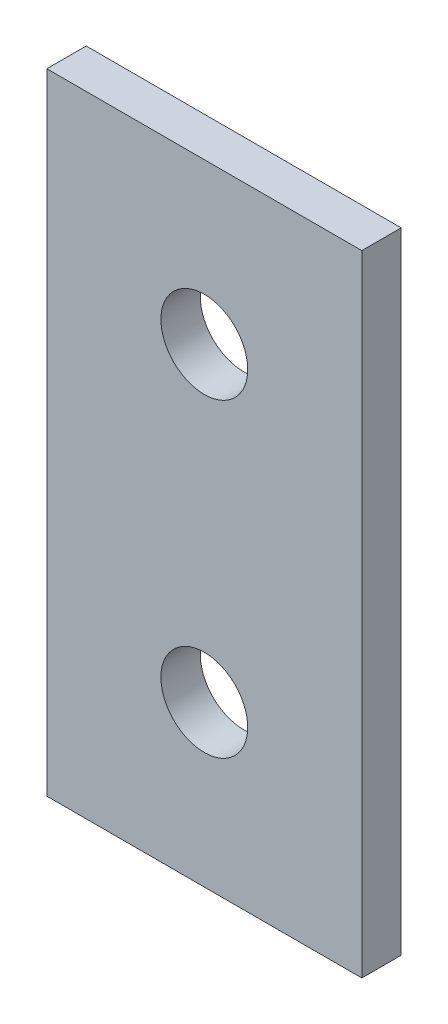
ISO-10303-21;
HEADER;
FILE_DESCRIPTION(('STEP AP214'),'2;1');
FILE_NAME('part.step','',(''),(''),'','','');
FILE_SCHEMA(('AUTOMOTIVE_DESIGN { 1 0 10303 214 1 1 1 1 }'));
ENDSEC;
DATA;
#1=APPLICATION_CONTEXT('core data for automotive mechanical design processes');
#2=APPLICATION_PROTOCOL_DEFINITION('international standard','automotive_design',2000,#1);
#3=PRODUCT_CONTEXT('',#1,'mechanical');
#4=PRODUCT('Part','Part','',(#3));
#5=PRODUCT_RELATED_PRODUCT_CATEGORY('part','',(#4));
#6=PRODUCT_DEFINITION_FORMATION('','',#4);
#7=PRODUCT_DEFINITION_CONTEXT('part definition',#1,'design');
#8=PRODUCT_DEFINITION('design','',#6,#7);
#9=PRODUCT_DEFINITION_SHAPE('','',#8);
#10=(LENGTH_UNIT() NAMED_UNIT(*) SI_UNIT(.MILLI.,.METRE.));
#11=(NAMED_UNIT(*) PLANE_ANGLE_UNIT() SI_UNIT($,.RADIAN.));
#12=(NAMED_UNIT(*) SI_UNIT($,.STERADIAN.) SOLID_ANGLE_UNIT());
#13=UNCERTAINTY_MEASURE_WITH_UNIT(LENGTH_MEASURE(1.E-05),#10,'distance_accuracy_value','');
#14=(GEOMETRIC_REPRESENTATION_CONTEXT(3) GLOBAL_UNCERTAINTY_ASSIGNED_CONTEXT((#13)) GLOBAL_UNIT_ASSIGNED_CONTEXT((#10,
#11,#12)) REPRESENTATION_CONTEXT('',''));
#15=CARTESIAN_POINT('',(0.,0.,0.));
#16=DIRECTION('',(0.,0.,1.));
#17=DIRECTION('',(1.,0.,0.));
#18=AXIS2_PLACEMENT_3D('',#15,#16,#17);
#19=CARTESIAN_POINT('',(0.,0.,3.175));
#20=DIRECTION('',(0.,0.,-1.));
#21=DIRECTION('',(-1.,0.,0.));
#22=AXIS2_PLACEMENT_3D('',#19,#20,#21);
#23=PLANE('',#22);
#24=DIRECTION('',(0.,1.,0.));
#25=VECTOR('',#24,1.);
#26=CARTESIAN_POINT('',(12.7,-25.4,3.175));
#27=LINE('',#26,#25);
#28=CARTESIAN_POINT('',(12.7,-25.4,3.175));
#29=VERTEX_POINT('',#28);
#30=CARTESIAN_POINT('',(12.7,25.4,3.175));
#31=VERTEX_POINT('',#30);
#32=EDGE_CURVE('E91',#29,#31,#27,.T.);
#33=ORIENTED_EDGE('',*,*,#32,.T.);
#34=DIRECTION('',(-1.,0.,0.));
#35=VECTOR('',#34,1.);
#36=CARTESIAN_POINT('',(-12.7,25.4,3.175));
#37=LINE('',#36,#35);
#38=CARTESIAN_POINT('',(-12.7,25.4,3.175));
#39=VERTEX_POINT('',#38);
#40=EDGE_CURVE('E86',#31,#39,#37,.T.);
#41=ORIENTED_EDGE('',*,*,#40,.T.);
#42=DIRECTION('',(0.,-1.,0.));
#43=VECTOR('',#42,1.);
#44=CARTESIAN_POINT('',(-12.7,-25.4,3.175));
#45=LINE('',#44,#43);
#46=CARTESIAN_POINT('',(-12.7,-25.4,3.175));
#47=VERTEX_POINT('',#46);
#48=EDGE_CURVE('E89',#39,#47,#45,.T.);
#49=ORIENTED_EDGE('',*,*,#48,.T.);
#50=DIRECTION('',(1.,0.,0.));
#51=VECTOR('',#50,1.);
#52=CARTESIAN_POINT('',(-12.7,-25.4,3.175));
#53=LINE('',#52,#51);
#54=EDGE_CURVE('E56',#47,#29,#53,.T.);
#55=ORIENTED_EDGE('',*,*,#54,.T.);
#56=EDGE_LOOP('',(#33,#41,#49,#55));
#57=FACE_BOUND('',#56,.T.);
#58=CARTESIAN_POINT('',(0.,12.5,3.175));
#59=DIRECTION('',(0.,0.,1.));
#60=DIRECTION('',(1.,0.,0.));
#61=AXIS2_PLACEMENT_3D('',#58,#59,#60);
#62=CIRCLE('',#61,3.5);
#63=CARTESIAN_POINT('',(3.5,12.5,3.175));
#64=VERTEX_POINT('',#63);
#65=EDGE_CURVE('E106',#64,#64,#62,.T.);
#66=ORIENTED_EDGE('',*,*,#65,.F.);
#67=EDGE_LOOP('',(#66));
#68=FACE_BOUND('',#67,.T.);
#69=CARTESIAN_POINT('',(0.,-12.5,3.175));
#70=DIRECTION('',(0.,0.,1.));
#71=DIRECTION('',(-1.,0.,0.));
#72=AXIS2_PLACEMENT_3D('',#69,#70,#71);
#73=CIRCLE('',#72,3.5);
#74=CARTESIAN_POINT('',(-3.5,-12.5,3.175));
#75=VERTEX_POINT('',#74);
#76=EDGE_CURVE('E121',#75,#75,#73,.T.);
#77=ORIENTED_EDGE('',*,*,#76,.F.);
#78=EDGE_LOOP('',(#77));
#79=FACE_BOUND('',#78,.T.);
#80=ADVANCED_FACE('F39',(#57,#68,#79),#23,.F.);
#81=CARTESIAN_POINT('',(0.,0.,0.));
#82=DIRECTION('',(0.,0.,-1.));
#83=DIRECTION('',(-1.,0.,0.));
#84=AXIS2_PLACEMENT_3D('',#81,#82,#83);
#85=PLANE('',#84);
#86=CARTESIAN_POINT('',(0.,12.5,0.));
#87=DIRECTION('',(0.,0.,1.));
#88=DIRECTION('',(1.,0.,0.));
#89=AXIS2_PLACEMENT_3D('',#86,#87,#88);
#90=CIRCLE('',#89,3.5);
#91=CARTESIAN_POINT('',(3.5,12.5,0.));
#92=VERTEX_POINT('',#91);
#93=EDGE_CURVE('E118',#92,#92,#90,.T.);
#94=ORIENTED_EDGE('',*,*,#93,.T.);
#95=EDGE_LOOP('',(#94));
#96=FACE_BOUND('',#95,.T.);
#97=DIRECTION('',(0.,1.,0.));
#98=VECTOR('',#97,1.);
#99=CARTESIAN_POINT('',(12.7,-25.4,0.));
#100=LINE('',#99,#98);
#101=CARTESIAN_POINT('',(12.7,-25.4,0.));
#102=VERTEX_POINT('',#101);
#103=CARTESIAN_POINT('',(12.7,25.4,0.));
#104=VERTEX_POINT('',#103);
#105=EDGE_CURVE('E103',#102,#104,#100,.T.);
#106=ORIENTED_EDGE('',*,*,#105,.F.);
#107=DIRECTION('',(1.,0.,0.));
#108=VECTOR('',#107,1.);
#109=CARTESIAN_POINT('',(-12.7,-25.4,0.));
#110=LINE('',#109,#108);
#111=CARTESIAN_POINT('',(-12.7,-25.4,0.));
#112=VERTEX_POINT('',#111);
#113=EDGE_CURVE('E79',#112,#102,#110,.T.);
#114=ORIENTED_EDGE('',*,*,#113,.F.);
#115=DIRECTION('',(0.,-1.,0.));
#116=VECTOR('',#115,1.);
#117=CARTESIAN_POINT('',(-12.7,-25.4,0.));
#118=LINE('',#117,#116);
#119=CARTESIAN_POINT('',(-12.7,25.4,0.));
#120=VERTEX_POINT('',#119);
#121=EDGE_CURVE('E73',#120,#112,#118,.T.);
#122=ORIENTED_EDGE('',*,*,#121,.F.);
#123=DIRECTION('',(-1.,0.,0.));
#124=VECTOR('',#123,1.);
#125=CARTESIAN_POINT('',(-12.7,25.4,0.));
#126=LINE('',#125,#124);
#127=EDGE_CURVE('E95',#104,#120,#126,.T.);
#128=ORIENTED_EDGE('',*,*,#127,.F.);
#129=EDGE_LOOP('',(#106,#114,#122,#128));
#130=FACE_BOUND('',#129,.T.);
#131=CARTESIAN_POINT('',(0.,-12.5,0.));
#132=DIRECTION('',(0.,0.,1.));
#133=DIRECTION('',(-1.,0.,0.));
#134=AXIS2_PLACEMENT_3D('',#131,#132,#133);
#135=CIRCLE('',#134,3.5);
#136=CARTESIAN_POINT('',(-3.5,-12.5,0.));
#137=VERTEX_POINT('',#136);
#138=EDGE_CURVE('E124',#137,#137,#135,.T.);
#139=ORIENTED_EDGE('',*,*,#138,.T.);
#140=EDGE_LOOP('',(#139));
#141=FACE_BOUND('',#140,.T.);
#142=ADVANCED_FACE('F114',(#96,#130,#141),#85,.T.);
#143=CARTESIAN_POINT('',(12.7,-25.4,3.175));
#144=DIRECTION('',(-1.,0.,0.));
#145=DIRECTION('',(0.,-1.,0.));
#146=AXIS2_PLACEMENT_3D('',#143,#144,#145);
#147=PLANE('',#146);
#148=ORIENTED_EDGE('',*,*,#105,.T.);
#149=DIRECTION('',(0.,0.,-1.));
#150=VECTOR('',#149,1.);
#151=CARTESIAN_POINT('',(12.7,25.4,3.175));
#152=LINE('',#151,#150);
#153=EDGE_CURVE('E11',#31,#104,#152,.T.);
#154=ORIENTED_EDGE('',*,*,#153,.F.);
#155=ORIENTED_EDGE('',*,*,#32,.F.);
#156=DIRECTION('',(0.,0.,-1.));
#157=VECTOR('',#156,1.);
#158=CARTESIAN_POINT('',(12.7,-25.4,3.175));
#159=LINE('',#158,#157);
#160=EDGE_CURVE('E99',#29,#102,#159,.T.);
#161=ORIENTED_EDGE('',*,*,#160,.T.);
#162=EDGE_LOOP('',(#148,#154,#155,#161));
#163=FACE_BOUND('',#162,.T.);
#164=ADVANCED_FACE('F41',(#163),#147,.F.);
#165=CARTESIAN_POINT('',(-12.7,25.4,3.175));
#166=DIRECTION('',(0.,-1.,0.));
#167=DIRECTION('',(1.,0.,0.));
#168=AXIS2_PLACEMENT_3D('',#165,#166,#167);
#169=PLANE('',#168);
#170=ORIENTED_EDGE('',*,*,#127,.T.);
#171=DIRECTION('',(0.,0.,-1.));
#172=VECTOR('',#171,1.);
#173=CARTESIAN_POINT('',(-12.7,25.4,3.175));
#174=LINE('',#173,#172);
#175=EDGE_CURVE('E48',#39,#120,#174,.T.);
#176=ORIENTED_EDGE('',*,*,#175,.F.);
#177=ORIENTED_EDGE('',*,*,#40,.F.);
#178=ORIENTED_EDGE('',*,*,#153,.T.);
#179=EDGE_LOOP('',(#170,#176,#177,#178));
#180=FACE_BOUND('',#179,.T.);
#181=ADVANCED_FACE('F94',(#180),#169,.F.);
#182=CARTESIAN_POINT('',(-12.7,-25.4,3.175));
#183=DIRECTION('',(1.,0.,0.));
#184=DIRECTION('',(0.,0.,-1.));
#185=AXIS2_PLACEMENT_3D('',#182,#183,#184);
#186=PLANE('',#185);
#187=ORIENTED_EDGE('',*,*,#121,.T.);
#188=DIRECTION('',(0.,0.,-1.));
#189=VECTOR('',#188,1.);
#190=CARTESIAN_POINT('',(-12.7,-25.4,3.175));
#191=LINE('',#190,#189);
#192=EDGE_CURVE('E96',#47,#112,#191,.T.);
#193=ORIENTED_EDGE('',*,*,#192,.F.);
#194=ORIENTED_EDGE('',*,*,#48,.F.);
#195=ORIENTED_EDGE('',*,*,#175,.T.);
#196=EDGE_LOOP('',(#187,#193,#194,#195));
#197=FACE_BOUND('',#196,.T.);
#198=ADVANCED_FACE('F97',(#197),#186,.F.);
#199=CARTESIAN_POINT('',(-12.7,-25.4,3.175));
#200=DIRECTION('',(0.,1.,0.));
#201=DIRECTION('',(0.,0.,1.));
#202=AXIS2_PLACEMENT_3D('',#199,#200,#201);
#203=PLANE('',#202);
#204=ORIENTED_EDGE('',*,*,#113,.T.);
#205=ORIENTED_EDGE('',*,*,#160,.F.);
#206=ORIENTED_EDGE('',*,*,#54,.F.);
#207=ORIENTED_EDGE('',*,*,#192,.T.);
#208=EDGE_LOOP('',(#204,#205,#206,#207));
#209=FACE_BOUND('',#208,.T.);
#210=ADVANCED_FACE('F111',(#209),#203,.F.);
#211=CARTESIAN_POINT('',(0.,12.5,3.175));
#212=DIRECTION('',(0.,0.,-1.));
#213=DIRECTION('',(-1.,0.,0.));
#214=AXIS2_PLACEMENT_3D('',#211,#212,#213);
#215=CYLINDRICAL_SURFACE('',#214,3.5);
#216=ORIENTED_EDGE('',*,*,#65,.T.);
#217=EDGE_LOOP('',(#216));
#218=FACE_BOUND('',#217,.T.);
#219=ORIENTED_EDGE('',*,*,#93,.F.);
#220=EDGE_LOOP('',(#219));
#221=FACE_BOUND('',#220,.T.);
#222=ADVANCED_FACE('F141',(#218,#221),#215,.F.);
#223=CARTESIAN_POINT('',(0.,-12.5,3.175));
#224=DIRECTION('',(0.,0.,-1.));
#225=DIRECTION('',(-1.,0.,0.));
#226=AXIS2_PLACEMENT_3D('',#223,#224,#225);
#227=CYLINDRICAL_SURFACE('',#226,3.5);
#228=ORIENTED_EDGE('',*,*,#76,.T.);
#229=EDGE_LOOP('',(#228));
#230=FACE_BOUND('',#229,.T.);
#231=ORIENTED_EDGE('',*,*,#138,.F.);
#232=EDGE_LOOP('',(#231));
#233=FACE_BOUND('',#232,.T.);
#234=ADVANCED_FACE('F130',(#230,#233),#227,.F.);
#235=CLOSED_SHELL('',(#80,#142,#164,#181,#198,#210,#222,#234));
#236=MANIFOLD_SOLID_BREP('B2',#235);
#237=ADVANCED_BREP_SHAPE_REPRESENTATION('',(#18,#236),#14);
#238=SHAPE_DEFINITION_REPRESENTATION(#9,#237);
ENDSEC;
END-ISO-10303-21;
